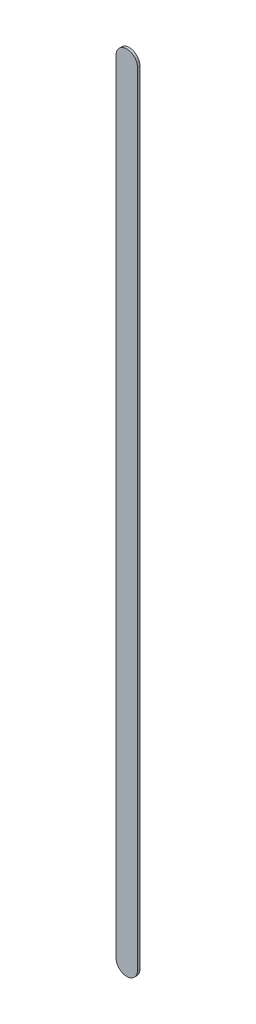
ISO-10303-21;
HEADER;
FILE_DESCRIPTION(('STEP AP214'),'2;1');
FILE_NAME('part.step','',(''),(''),'','','');
FILE_SCHEMA(('AUTOMOTIVE_DESIGN { 1 0 10303 214 1 1 1 1 }'));
ENDSEC;
DATA;
#1=APPLICATION_CONTEXT('core data for automotive mechanical design processes');
#2=APPLICATION_PROTOCOL_DEFINITION('international standard','automotive_design',2000,#1);
#3=PRODUCT_CONTEXT('',#1,'mechanical');
#4=PRODUCT('Part','Part','',(#3));
#5=PRODUCT_RELATED_PRODUCT_CATEGORY('part','',(#4));
#6=PRODUCT_DEFINITION_FORMATION('','',#4);
#7=PRODUCT_DEFINITION_CONTEXT('part definition',#1,'design');
#8=PRODUCT_DEFINITION('design','',#6,#7);
#9=PRODUCT_DEFINITION_SHAPE('','',#8);
#10=(LENGTH_UNIT() NAMED_UNIT(*) SI_UNIT(.MILLI.,.METRE.));
#11=(NAMED_UNIT(*) PLANE_ANGLE_UNIT() SI_UNIT($,.RADIAN.));
#12=(NAMED_UNIT(*) SI_UNIT($,.STERADIAN.) SOLID_ANGLE_UNIT());
#13=UNCERTAINTY_MEASURE_WITH_UNIT(LENGTH_MEASURE(1.E-05),#10,'distance_accuracy_value','');
#14=(GEOMETRIC_REPRESENTATION_CONTEXT(3) GLOBAL_UNCERTAINTY_ASSIGNED_CONTEXT((#13)) GLOBAL_UNIT_ASSIGNED_CONTEXT((#10,
#11,#12)) REPRESENTATION_CONTEXT('',''));
#15=CARTESIAN_POINT('',(0.,0.,0.));
#16=DIRECTION('',(0.,0.,1.));
#17=DIRECTION('',(1.,0.,0.));
#18=AXIS2_PLACEMENT_3D('',#15,#16,#17);
#19=CARTESIAN_POINT('',(128.85,-69.9125,1.635));
#20=DIRECTION('',(0.,0.,1.));
#21=DIRECTION('',(1.,0.,0.));
#22=AXIS2_PLACEMENT_3D('',#19,#20,#21);
#23=PLANE('',#22);
#24=DIRECTION('',(0.,-1.,0.));
#25=VECTOR('',#24,1.);
#26=CARTESIAN_POINT('',(128.85,-69.9125,1.635));
#27=LINE('',#26,#25);
#28=CARTESIAN_POINT('',(128.85,-69.9125,1.635));
#29=VERTEX_POINT('',#28);
#30=CARTESIAN_POINT('',(128.85,-80.84,1.635));
#31=VERTEX_POINT('',#30);
#32=EDGE_CURVE('E80',#29,#31,#27,.T.);
#33=ORIENTED_EDGE('',*,*,#32,.T.);
#34=CARTESIAN_POINT('',(129.,-80.84,1.635));
#35=DIRECTION('',(0.,0.,1.));
#36=DIRECTION('',(-1.,0.,0.));
#37=AXIS2_PLACEMENT_3D('',#34,#35,#36);
#38=CIRCLE('',#37,0.15);
#39=CARTESIAN_POINT('',(129.15,-80.84,1.635));
#40=VERTEX_POINT('',#39);
#41=EDGE_CURVE('E78',#31,#40,#38,.T.);
#42=ORIENTED_EDGE('',*,*,#41,.T.);
#43=DIRECTION('',(0.,1.,0.));
#44=VECTOR('',#43,1.);
#45=CARTESIAN_POINT('',(129.15,-80.84,1.635));
#46=LINE('',#45,#44);
#47=CARTESIAN_POINT('',(129.15,-69.9125,1.635));
#48=VERTEX_POINT('',#47);
#49=EDGE_CURVE('E66',#40,#48,#46,.T.);
#50=ORIENTED_EDGE('',*,*,#49,.T.);
#51=CARTESIAN_POINT('',(129.,-69.9125,1.635));
#52=DIRECTION('',(0.,0.,1.));
#53=DIRECTION('',(1.,0.,0.));
#54=AXIS2_PLACEMENT_3D('',#51,#52,#53);
#55=CIRCLE('',#54,0.15);
#56=EDGE_CURVE('E11',#48,#29,#55,.T.);
#57=ORIENTED_EDGE('',*,*,#56,.T.);
#58=EDGE_LOOP('',(#33,#42,#50,#57));
#59=FACE_BOUND('',#58,.T.);
#60=ADVANCED_FACE('F17',(#59),#23,.T.);
#61=CARTESIAN_POINT('',(128.85,-69.9125,1.6));
#62=DIRECTION('',(0.,0.,1.));
#63=DIRECTION('',(1.,0.,0.));
#64=AXIS2_PLACEMENT_3D('',#61,#62,#63);
#65=PLANE('',#64);
#66=CARTESIAN_POINT('',(129.,-69.9125,1.6));
#67=DIRECTION('',(0.,0.,1.));
#68=DIRECTION('',(1.,0.,0.));
#69=AXIS2_PLACEMENT_3D('',#66,#67,#68);
#70=CIRCLE('',#69,0.15);
#71=CARTESIAN_POINT('',(129.15,-69.9125,1.6));
#72=VERTEX_POINT('',#71);
#73=CARTESIAN_POINT('',(128.85,-69.9125,1.6));
#74=VERTEX_POINT('',#73);
#75=EDGE_CURVE('E27',#72,#74,#70,.T.);
#76=ORIENTED_EDGE('',*,*,#75,.F.);
#77=DIRECTION('',(0.,1.,0.));
#78=VECTOR('',#77,1.);
#79=CARTESIAN_POINT('',(129.15,-80.84,1.6));
#80=LINE('',#79,#78);
#81=CARTESIAN_POINT('',(129.15,-80.84,1.6));
#82=VERTEX_POINT('',#81);
#83=EDGE_CURVE('E85',#82,#72,#80,.T.);
#84=ORIENTED_EDGE('',*,*,#83,.F.);
#85=CARTESIAN_POINT('',(129.,-80.84,1.6));
#86=DIRECTION('',(0.,0.,1.));
#87=DIRECTION('',(-1.,0.,0.));
#88=AXIS2_PLACEMENT_3D('',#85,#86,#87);
#89=CIRCLE('',#88,0.15);
#90=CARTESIAN_POINT('',(128.85,-80.84,1.6));
#91=VERTEX_POINT('',#90);
#92=EDGE_CURVE('E88',#91,#82,#89,.T.);
#93=ORIENTED_EDGE('',*,*,#92,.F.);
#94=DIRECTION('',(0.,-1.,0.));
#95=VECTOR('',#94,1.);
#96=CARTESIAN_POINT('',(128.85,-69.9125,1.6));
#97=LINE('',#96,#95);
#98=EDGE_CURVE('E99',#74,#91,#97,.T.);
#99=ORIENTED_EDGE('',*,*,#98,.F.);
#100=EDGE_LOOP('',(#76,#84,#93,#99));
#101=FACE_BOUND('',#100,.T.);
#102=ADVANCED_FACE('F19',(#101),#65,.F.);
#103=CARTESIAN_POINT('',(129.,-69.9125,1.6));
#104=DIRECTION('',(0.,0.,-1.));
#105=DIRECTION('',(1.,0.,0.));
#106=AXIS2_PLACEMENT_3D('',#103,#104,#105);
#107=CYLINDRICAL_SURFACE('',#106,0.15);
#108=ORIENTED_EDGE('',*,*,#75,.T.);
#109=DIRECTION('',(0.,0.,1.));
#110=VECTOR('',#109,1.);
#111=CARTESIAN_POINT('',(128.85,-69.9125,1.6));
#112=LINE('',#111,#110);
#113=EDGE_CURVE('E95',#74,#29,#112,.T.);
#114=ORIENTED_EDGE('',*,*,#113,.T.);
#115=ORIENTED_EDGE('',*,*,#56,.F.);
#116=DIRECTION('',(0.,0.,1.));
#117=VECTOR('',#116,1.);
#118=CARTESIAN_POINT('',(129.15,-69.9125,1.6));
#119=LINE('',#118,#117);
#120=EDGE_CURVE('E73',#72,#48,#119,.T.);
#121=ORIENTED_EDGE('',*,*,#120,.F.);
#122=EDGE_LOOP('',(#108,#114,#115,#121));
#123=FACE_BOUND('',#122,.T.);
#124=ADVANCED_FACE('F152',(#123),#107,.T.);
#125=CARTESIAN_POINT('',(129.15,-80.84,1.6));
#126=DIRECTION('',(-1.,0.,0.));
#127=DIRECTION('',(0.,0.,1.));
#128=AXIS2_PLACEMENT_3D('',#125,#126,#127);
#129=PLANE('',#128);
#130=ORIENTED_EDGE('',*,*,#83,.T.);
#131=ORIENTED_EDGE('',*,*,#120,.T.);
#132=ORIENTED_EDGE('',*,*,#49,.F.);
#133=DIRECTION('',(0.,0.,1.));
#134=VECTOR('',#133,1.);
#135=CARTESIAN_POINT('',(129.15,-80.84,1.6));
#136=LINE('',#135,#134);
#137=EDGE_CURVE('E71',#82,#40,#136,.T.);
#138=ORIENTED_EDGE('',*,*,#137,.F.);
#139=EDGE_LOOP('',(#130,#131,#132,#138));
#140=FACE_BOUND('',#139,.T.);
#141=ADVANCED_FACE('F69',(#140),#129,.F.);
#142=CARTESIAN_POINT('',(129.,-80.84,1.6));
#143=DIRECTION('',(0.,0.,-1.));
#144=DIRECTION('',(-1.,0.,0.));
#145=AXIS2_PLACEMENT_3D('',#142,#143,#144);
#146=CYLINDRICAL_SURFACE('',#145,0.15);
#147=ORIENTED_EDGE('',*,*,#92,.T.);
#148=ORIENTED_EDGE('',*,*,#137,.T.);
#149=ORIENTED_EDGE('',*,*,#41,.F.);
#150=DIRECTION('',(0.,0.,1.));
#151=VECTOR('',#150,1.);
#152=CARTESIAN_POINT('',(128.85,-80.84,1.6));
#153=LINE('',#152,#151);
#154=EDGE_CURVE('E101',#91,#31,#153,.T.);
#155=ORIENTED_EDGE('',*,*,#154,.F.);
#156=EDGE_LOOP('',(#147,#148,#149,#155));
#157=FACE_BOUND('',#156,.T.);
#158=ADVANCED_FACE('F87',(#157),#146,.T.);
#159=CARTESIAN_POINT('',(128.85,-69.9125,1.6));
#160=DIRECTION('',(1.,0.,0.));
#161=DIRECTION('',(0.,1.,0.));
#162=AXIS2_PLACEMENT_3D('',#159,#160,#161);
#163=PLANE('',#162);
#164=ORIENTED_EDGE('',*,*,#98,.T.);
#165=ORIENTED_EDGE('',*,*,#154,.T.);
#166=ORIENTED_EDGE('',*,*,#32,.F.);
#167=ORIENTED_EDGE('',*,*,#113,.F.);
#168=EDGE_LOOP('',(#164,#165,#166,#167));
#169=FACE_BOUND('',#168,.T.);
#170=ADVANCED_FACE('F150',(#169),#163,.F.);
#171=CLOSED_SHELL('',(#60,#102,#124,#141,#158,#170));
#172=MANIFOLD_SOLID_BREP('B1',#171);
#173=ADVANCED_BREP_SHAPE_REPRESENTATION('',(#18,#172),#14);
#174=SHAPE_DEFINITION_REPRESENTATION(#9,#173);
ENDSEC;
END-ISO-10303-21;
